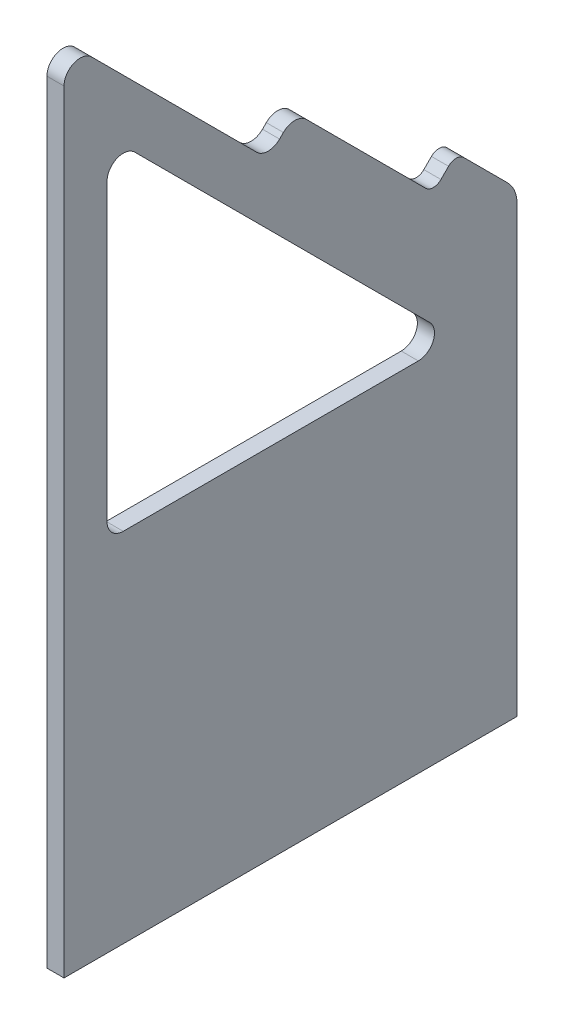
ISO-10303-21;
HEADER;
FILE_DESCRIPTION(('STEP AP214'),'2;1');
FILE_NAME('part.step','',(''),(''),'','','');
FILE_SCHEMA(('AUTOMOTIVE_DESIGN { 1 0 10303 214 1 1 1 1 }'));
ENDSEC;
DATA;
#1=APPLICATION_CONTEXT('core data for automotive mechanical design processes');
#2=APPLICATION_PROTOCOL_DEFINITION('international standard','automotive_design',2000,#1);
#3=PRODUCT_CONTEXT('',#1,'mechanical');
#4=PRODUCT('Part','Part','',(#3));
#5=PRODUCT_RELATED_PRODUCT_CATEGORY('part','',(#4));
#6=PRODUCT_DEFINITION_FORMATION('','',#4);
#7=PRODUCT_DEFINITION_CONTEXT('part definition',#1,'design');
#8=PRODUCT_DEFINITION('design','',#6,#7);
#9=PRODUCT_DEFINITION_SHAPE('','',#8);
#10=(LENGTH_UNIT() NAMED_UNIT(*) SI_UNIT(.MILLI.,.METRE.));
#11=(NAMED_UNIT(*) PLANE_ANGLE_UNIT() SI_UNIT($,.RADIAN.));
#12=(NAMED_UNIT(*) SI_UNIT($,.STERADIAN.) SOLID_ANGLE_UNIT());
#13=UNCERTAINTY_MEASURE_WITH_UNIT(LENGTH_MEASURE(1.E-05),#10,'distance_accuracy_value','');
#14=(GEOMETRIC_REPRESENTATION_CONTEXT(3) GLOBAL_UNCERTAINTY_ASSIGNED_CONTEXT((#13)) GLOBAL_UNIT_ASSIGNED_CONTEXT((#10,
#11,#12)) REPRESENTATION_CONTEXT('',''));
#15=CARTESIAN_POINT('',(0.,0.,0.));
#16=DIRECTION('',(0.,0.,1.));
#17=DIRECTION('',(1.,0.,0.));
#18=AXIS2_PLACEMENT_3D('',#15,#16,#17);
#19=CARTESIAN_POINT('',(3.175,150.710678118654,42.0728534805994));
#20=DIRECTION('',(0.,0.,-1.));
#21=DIRECTION('',(0.,1.,0.));
#22=AXIS2_PLACEMENT_3D('',#19,#20,#21);
#23=PLANE('',#22);
#24=DIRECTION('',(0.,-1.,0.));
#25=VECTOR('',#24,1.);
#26=CARTESIAN_POINT('',(3.175,150.710678118654,42.0728534805994));
#27=LINE('',#26,#25);
#28=CARTESIAN_POINT('',(3.175,143.468037431535,42.0728534805994));
#29=VERTEX_POINT('',#28);
#30=CARTESIAN_POINT('',(3.175,0.,42.0728534805994));
#31=VERTEX_POINT('',#30);
#32=EDGE_CURVE('E179',#29,#31,#27,.T.);
#33=ORIENTED_EDGE('',*,*,#32,.F.);
#34=DIRECTION('',(-1.,0.,0.));
#35=VECTOR('',#34,1.);
#36=CARTESIAN_POINT('',(3.175,143.468037431535,42.0728534805994));
#37=LINE('',#36,#35);
#38=CARTESIAN_POINT('',(0.,143.468037431535,42.0728534805994));
#39=VERTEX_POINT('',#38);
#40=EDGE_CURVE('E250',#29,#39,#37,.T.);
#41=ORIENTED_EDGE('',*,*,#40,.T.);
#42=DIRECTION('',(0.,-1.,0.));
#43=VECTOR('',#42,1.);
#44=CARTESIAN_POINT('',(0.,150.710678118654,42.0728534805994));
#45=LINE('',#44,#43);
#46=CARTESIAN_POINT('',(0.,0.,42.0728534805994));
#47=VERTEX_POINT('',#46);
#48=EDGE_CURVE('E207',#39,#47,#45,.T.);
#49=ORIENTED_EDGE('',*,*,#48,.T.);
#50=DIRECTION('',(-1.,0.,0.));
#51=VECTOR('',#50,1.);
#52=CARTESIAN_POINT('',(3.175,0.,42.0728534805994));
#53=LINE('',#52,#51);
#54=EDGE_CURVE('E199',#31,#47,#53,.T.);
#55=ORIENTED_EDGE('',*,*,#54,.F.);
#56=EDGE_LOOP('',(#33,#41,#49,#55));
#57=FACE_BOUND('',#56,.T.);
#58=ADVANCED_FACE('F41',(#57),#23,.F.);
#59=CARTESIAN_POINT('',(3.175,0.,42.0728534805994));
#60=DIRECTION('',(0.,1.,0.));
#61=DIRECTION('',(0.,0.,1.));
#62=AXIS2_PLACEMENT_3D('',#59,#60,#61);
#63=PLANE('',#62);
#64=DIRECTION('',(0.,0.,-1.));
#65=VECTOR('',#64,1.);
#66=CARTESIAN_POINT('',(0.,0.,42.0728534805994));
#67=LINE('',#66,#65);
#68=CARTESIAN_POINT('',(0.,0.,-42.0728534805994));
#69=VERTEX_POINT('',#68);
#70=EDGE_CURVE('E393',#47,#69,#67,.T.);
#71=ORIENTED_EDGE('',*,*,#70,.T.);
#72=DIRECTION('',(-1.,0.,0.));
#73=VECTOR('',#72,1.);
#74=CARTESIAN_POINT('',(3.175,0.,-42.0728534805994));
#75=LINE('',#74,#73);
#76=CARTESIAN_POINT('',(3.175,0.,-42.0728534805994));
#77=VERTEX_POINT('',#76);
#78=EDGE_CURVE('E201',#77,#69,#75,.T.);
#79=ORIENTED_EDGE('',*,*,#78,.F.);
#80=DIRECTION('',(0.,0.,-1.));
#81=VECTOR('',#80,1.);
#82=CARTESIAN_POINT('',(3.175,0.,42.0728534805994));
#83=LINE('',#82,#81);
#84=EDGE_CURVE('E185',#31,#77,#83,.T.);
#85=ORIENTED_EDGE('',*,*,#84,.F.);
#86=ORIENTED_EDGE('',*,*,#54,.T.);
#87=EDGE_LOOP('',(#71,#79,#85,#86));
#88=FACE_BOUND('',#87,.T.);
#89=ADVANCED_FACE('F198',(#88),#63,.F.);
#90=CARTESIAN_POINT('',(3.175,0.,-42.0728534805994));
#91=DIRECTION('',(0.,0.,1.));
#92=DIRECTION('',(0.,-1.,0.));
#93=AXIS2_PLACEMENT_3D('',#90,#91,#92);
#94=PLANE('',#93);
#95=DIRECTION('',(0.,1.,0.));
#96=VECTOR('',#95,1.);
#97=CARTESIAN_POINT('',(0.,0.,-42.0728534805994));
#98=LINE('',#97,#96);
#99=CARTESIAN_POINT('',(0.,82.4644660940667,-42.0728534805994));
#100=VERTEX_POINT('',#99);
#101=EDGE_CURVE('E396',#69,#100,#98,.T.);
#102=ORIENTED_EDGE('',*,*,#101,.T.);
#103=DIRECTION('',(-1.,0.,0.));
#104=VECTOR('',#103,1.);
#105=CARTESIAN_POINT('',(3.175,82.4644660940667,-42.0728534805994));
#106=LINE('',#105,#104);
#107=CARTESIAN_POINT('',(3.175,82.4644660940667,-42.0728534805994));
#108=VERTEX_POINT('',#107);
#109=EDGE_CURVE('E223',#100,#108,#106,.F.);
#110=ORIENTED_EDGE('',*,*,#109,.T.);
#111=DIRECTION('',(0.,1.,0.));
#112=VECTOR('',#111,1.);
#113=CARTESIAN_POINT('',(3.175,0.,-42.0728534805994));
#114=LINE('',#113,#112);
#115=EDGE_CURVE('E204',#77,#108,#114,.T.);
#116=ORIENTED_EDGE('',*,*,#115,.F.);
#117=ORIENTED_EDGE('',*,*,#78,.T.);
#118=EDGE_LOOP('',(#102,#110,#116,#117));
#119=FACE_BOUND('',#118,.T.);
#120=ADVANCED_FACE('F428',(#119),#94,.F.);
#121=CARTESIAN_POINT('',(3.175,84.9497474683053,-42.0728534805994));
#122=DIRECTION('',(0.,-0.707106781186558,0.707106781186537));
#123=DIRECTION('',(0.,-0.707106781186537,-0.707106781186558));
#124=AXIS2_PLACEMENT_3D('',#121,#122,#123);
#125=PLANE('',#124);
#126=DIRECTION('',(0.,0.707106781186537,0.707106781186558));
#127=VECTOR('',#126,1.);
#128=CARTESIAN_POINT('',(0.,84.9497474683053,-42.0728534805994));
#129=LINE('',#128,#127);
#130=CARTESIAN_POINT('',(0.,86.707106781186,-40.3154941677186));
#131=VERTEX_POINT('',#130);
#132=CARTESIAN_POINT('',(0.,94.8492424049166,-32.1733585439878));
#133=VERTEX_POINT('',#132);
#134=EDGE_CURVE('E400',#131,#133,#129,.T.);
#135=ORIENTED_EDGE('',*,*,#134,.T.);
#136=DIRECTION('',(1.,0.,0.));
#137=VECTOR('',#136,1.);
#138=CARTESIAN_POINT('',(3.175,94.8492424049166,-32.1733585439878));
#139=LINE('',#138,#137);
#140=CARTESIAN_POINT('',(3.175,94.8492424049166,-32.1733585439878));
#141=VERTEX_POINT('',#140);
#142=EDGE_CURVE('E292',#133,#141,#139,.T.);
#143=ORIENTED_EDGE('',*,*,#142,.T.);
#144=DIRECTION('',(0.,0.707106781186537,0.707106781186558));
#145=VECTOR('',#144,1.);
#146=CARTESIAN_POINT('',(3.175,84.9497474683053,-42.0728534805994));
#147=LINE('',#146,#145);
#148=CARTESIAN_POINT('',(3.175,86.707106781186,-40.3154941677186));
#149=VERTEX_POINT('',#148);
#150=EDGE_CURVE('E384',#149,#141,#147,.T.);
#151=ORIENTED_EDGE('',*,*,#150,.F.);
#152=DIRECTION('',(-1.,0.,0.));
#153=VECTOR('',#152,1.);
#154=CARTESIAN_POINT('',(3.175,86.707106781186,-40.3154941677186));
#155=LINE('',#154,#153);
#156=EDGE_CURVE('E210',#149,#131,#155,.T.);
#157=ORIENTED_EDGE('',*,*,#156,.T.);
#158=EDGE_LOOP('',(#135,#143,#151,#157));
#159=FACE_BOUND('',#158,.T.);
#160=ADVANCED_FACE('F479',(#159),#125,.F.);
#161=CARTESIAN_POINT('',(3.175,96.2634559672896,-30.7591449816147));
#162=DIRECTION('',(0.,-0.70710678118655,-0.707106781186545));
#163=DIRECTION('',(0.,0.707106781186545,-0.70710678118655));
#164=AXIS2_PLACEMENT_3D('',#161,#162,#163);
#165=PLANE('',#164);
#166=DIRECTION('',(0.,-0.707106781186545,0.70710678118655));
#167=VECTOR('',#166,1.);
#168=CARTESIAN_POINT('',(0.,96.2634559672896,-30.7591449816147));
#169=LINE('',#168,#167);
#170=CARTESIAN_POINT('',(0.,94.8492424049166,-29.3449314192416));
#171=VERTEX_POINT('',#170);
#172=CARTESIAN_POINT('',(0.,93.4350288425434,-27.9307178568685));
#173=VERTEX_POINT('',#172);
#174=EDGE_CURVE('E404',#171,#173,#169,.T.);
#175=ORIENTED_EDGE('',*,*,#174,.T.);
#176=DIRECTION('',(1.,0.,0.));
#177=VECTOR('',#176,1.);
#178=CARTESIAN_POINT('',(3.175,93.4350288425434,-27.9307178568685));
#179=LINE('',#178,#177);
#180=CARTESIAN_POINT('',(3.175,93.4350288425434,-27.9307178568685));
#181=VERTEX_POINT('',#180);
#182=EDGE_CURVE('E284',#173,#181,#179,.T.);
#183=ORIENTED_EDGE('',*,*,#182,.T.);
#184=DIRECTION('',(0.,-0.707106781186545,0.70710678118655));
#185=VECTOR('',#184,1.);
#186=CARTESIAN_POINT('',(3.175,96.2634559672896,-30.7591449816147));
#187=LINE('',#186,#185);
#188=CARTESIAN_POINT('',(3.175,94.8492424049166,-29.3449314192416));
#189=VERTEX_POINT('',#188);
#190=EDGE_CURVE('E337',#189,#181,#187,.T.);
#191=ORIENTED_EDGE('',*,*,#190,.F.);
#192=DIRECTION('',(1.,0.,0.));
#193=VECTOR('',#192,1.);
#194=CARTESIAN_POINT('',(3.175,94.8492424049166,-29.3449314192416));
#195=LINE('',#194,#193);
#196=EDGE_CURVE('E281',#189,#171,#195,.F.);
#197=ORIENTED_EDGE('',*,*,#196,.T.);
#198=EDGE_LOOP('',(#175,#183,#191,#197));
#199=FACE_BOUND('',#198,.T.);
#200=ADVANCED_FACE('F472',(#199),#165,.F.);
#201=CARTESIAN_POINT('',(3.175,79.9999999999991,-28.637824638055));
#202=DIRECTION('',(0.,-0.707106781186544,0.707106781186551));
#203=DIRECTION('',(0.,-0.707106781186551,-0.707106781186544));
#204=AXIS2_PLACEMENT_3D('',#201,#202,#203);
#205=PLANE('',#204);
#206=DIRECTION('',(0.,0.707106781186551,0.707106781186544));
#207=VECTOR('',#206,1.);
#208=CARTESIAN_POINT('',(3.175,79.9999999999991,-28.637824638055));
#209=LINE('',#208,#207);
#210=CARTESIAN_POINT('',(3.175,114.915999231106,6.27817459305203));
#211=VERTEX_POINT('',#210);
#212=CARTESIAN_POINT('',(3.175,145.589357775094,36.9515331370397));
#213=VERTEX_POINT('',#212);
#214=EDGE_CURVE('E217',#211,#213,#209,.T.);
#215=ORIENTED_EDGE('',*,*,#214,.F.);
#216=DIRECTION('',(1.,0.,0.));
#217=VECTOR('',#216,1.);
#218=CARTESIAN_POINT('',(3.175,114.915999231106,6.27817459305203));
#219=LINE('',#218,#217);
#220=CARTESIAN_POINT('',(0.,114.915999231106,6.27817459305203));
#221=VERTEX_POINT('',#220);
#222=EDGE_CURVE('E315',#211,#221,#219,.F.);
#223=ORIENTED_EDGE('',*,*,#222,.T.);
#224=DIRECTION('',(0.,0.707106781186551,0.707106781186544));
#225=VECTOR('',#224,1.);
#226=CARTESIAN_POINT('',(0.,79.9999999999991,-28.637824638055));
#227=LINE('',#226,#225);
#228=CARTESIAN_POINT('',(0.,145.589357775094,36.9515331370397));
#229=VERTEX_POINT('',#228);
#230=EDGE_CURVE('E194',#221,#229,#227,.T.);
#231=ORIENTED_EDGE('',*,*,#230,.T.);
#232=DIRECTION('',(-1.,0.,0.));
#233=VECTOR('',#232,1.);
#234=CARTESIAN_POINT('',(3.175,145.589357775094,36.9515331370397));
#235=LINE('',#234,#233);
#236=EDGE_CURVE('E257',#229,#213,#235,.F.);
#237=ORIENTED_EDGE('',*,*,#236,.T.);
#238=EDGE_LOOP('',(#215,#223,#231,#237));
#239=FACE_BOUND('',#238,.T.);
#240=ADVANCED_FACE('F333',(#239),#205,.F.);
#241=CARTESIAN_POINT('',(3.175,0.,0.));
#242=DIRECTION('',(1.,0.,0.));
#243=DIRECTION('',(0.,0.,-1.));
#244=AXIS2_PLACEMENT_3D('',#241,#242,#243);
#245=PLANE('',#244);
#246=DIRECTION('',(0.,0.707106781186547,0.707106781186548));
#247=VECTOR('',#246,1.);
#248=CARTESIAN_POINT('',(3.175,92.0208152801703,-26.5165042944954));
#249=LINE('',#248,#247);
#250=CARTESIAN_POINT('',(3.175,93.4350288425434,-25.1022907321223));
#251=VERTEX_POINT('',#250);
#252=CARTESIAN_POINT('',(3.175,115.623106012293,-2.91421356237295));
#253=VERTEX_POINT('',#252);
#254=EDGE_CURVE('E358',#251,#253,#249,.T.);
#255=ORIENTED_EDGE('',*,*,#254,.T.);
#256=CARTESIAN_POINT('',(3.175,113.501785668733,-0.792893218813307));
#257=DIRECTION('',(1.,0.,0.));
#258=DIRECTION('',(0.,0.,-1.));
#259=AXIS2_PLACEMENT_3D('',#256,#257,#258);
#260=CIRCLE('',#259,3.);
#261=CARTESIAN_POINT('',(3.175,115.623106012293,1.32842712474633));
#262=VERTEX_POINT('',#261);
#263=EDGE_CURVE('E65',#253,#262,#260,.T.);
#264=ORIENTED_EDGE('',*,*,#263,.T.);
#265=DIRECTION('',(0.,-0.707106781186547,0.707106781186548));
#266=VECTOR('',#265,1.);
#267=CARTESIAN_POINT('',(3.175,117.744426355852,-0.792893218813311));
#268=LINE('',#267,#266);
#269=CARTESIAN_POINT('',(3.175,114.915999231106,2.03553390593272));
#270=VERTEX_POINT('',#269);
#271=EDGE_CURVE('E328',#262,#270,#268,.T.);
#272=ORIENTED_EDGE('',*,*,#271,.T.);
#273=CARTESIAN_POINT('',(3.175,117.037319574666,4.15685424949237));
#274=DIRECTION('',(1.,0.,0.));
#275=DIRECTION('',(0.,0.,-1.));
#276=AXIS2_PLACEMENT_3D('',#273,#274,#275);
#277=CIRCLE('',#276,3.);
#278=EDGE_CURVE('E50',#270,#211,#277,.F.);
#279=ORIENTED_EDGE('',*,*,#278,.T.);
#280=ORIENTED_EDGE('',*,*,#214,.T.);
#281=CARTESIAN_POINT('',(3.175,143.468037431535,39.0728534805994));
#282=DIRECTION('',(1.,0.,0.));
#283=DIRECTION('',(0.,0.,-1.));
#284=AXIS2_PLACEMENT_3D('',#281,#282,#283);
#285=CIRCLE('',#284,3.);
#286=EDGE_CURVE('E188',#213,#29,#285,.T.);
#287=ORIENTED_EDGE('',*,*,#286,.T.);
#288=ORIENTED_EDGE('',*,*,#32,.T.);
#289=ORIENTED_EDGE('',*,*,#84,.T.);
#290=ORIENTED_EDGE('',*,*,#115,.T.);
#291=CARTESIAN_POINT('',(3.175,82.4644660940667,-36.0728534805994));
#292=DIRECTION('',(1.,0.,0.));
#293=DIRECTION('',(0.,0.,-1.));
#294=AXIS2_PLACEMENT_3D('',#291,#292,#293);
#295=CIRCLE('',#294,6.);
#296=EDGE_CURVE('E226',#108,#149,#295,.T.);
#297=ORIENTED_EDGE('',*,*,#296,.T.);
#298=ORIENTED_EDGE('',*,*,#150,.T.);
#299=CARTESIAN_POINT('',(3.175,93.4350288425435,-30.7591449816147));
#300=DIRECTION('',(1.,0.,0.));
#301=DIRECTION('',(0.,0.,-1.));
#302=AXIS2_PLACEMENT_3D('',#299,#300,#301);
#303=CIRCLE('',#302,2.);
#304=EDGE_CURVE('E296',#141,#189,#303,.T.);
#305=ORIENTED_EDGE('',*,*,#304,.T.);
#306=ORIENTED_EDGE('',*,*,#190,.T.);
#307=CARTESIAN_POINT('',(3.175,94.8492424049165,-26.5165042944954));
#308=DIRECTION('',(1.,0.,0.));
#309=DIRECTION('',(0.,0.,-1.));
#310=AXIS2_PLACEMENT_3D('',#307,#308,#309);
#311=CIRCLE('',#310,2.);
#312=EDGE_CURVE('E302',#181,#251,#311,.F.);
#313=ORIENTED_EDGE('',*,*,#312,.T.);
#314=EDGE_LOOP('',(#255,#264,#272,#279,#280,#287,#288,#289,#290,#297,#298,#305,#306,#313));
#315=FACE_BOUND('',#314,.T.);
#316=DIRECTION('',(0.,0.707106781186547,0.707106781186548));
#317=VECTOR('',#316,1.);
#318=CARTESIAN_POINT('',(3.175,131.396969619669,34.0728534805994));
#319=LINE('',#318,#317);
#320=CARTESIAN_POINT('',(3.175,71.4713203432283,-25.852795795841));
#321=VERTEX_POINT('',#320);
#322=CARTESIAN_POINT('',(3.175,126.275649276109,28.9515331370397));
#323=VERTEX_POINT('',#322);
#324=EDGE_CURVE('E348',#321,#323,#319,.T.);
#325=ORIENTED_EDGE('',*,*,#324,.F.);
#326=CARTESIAN_POINT('',(3.175,69.3499999996687,-23.7314754522813));
#327=DIRECTION('',(1.,0.,0.));
#328=DIRECTION('',(0.,0.,-1.));
#329=AXIS2_PLACEMENT_3D('',#326,#327,#328);
#330=CIRCLE('',#329,3.);
#331=CARTESIAN_POINT('',(3.175,66.3499999996687,-23.7314754522813));
#332=VERTEX_POINT('',#331);
#333=EDGE_CURVE('E263',#321,#332,#330,.F.);
#334=ORIENTED_EDGE('',*,*,#333,.T.);
#335=DIRECTION('',(0.,0.,-1.));
#336=VECTOR('',#335,1.);
#337=CARTESIAN_POINT('',(3.175,66.3499999996687,-30.9741161394006));
#338=LINE('',#337,#336);
#339=CARTESIAN_POINT('',(3.175,66.3499999996687,31.0728534805994));
#340=VERTEX_POINT('',#339);
#341=EDGE_CURVE('E368',#340,#332,#338,.T.);
#342=ORIENTED_EDGE('',*,*,#341,.F.);
#343=CARTESIAN_POINT('',(3.175,69.3499999996687,31.0728534805994));
#344=DIRECTION('',(1.,0.,0.));
#345=DIRECTION('',(0.,0.,-1.));
#346=AXIS2_PLACEMENT_3D('',#343,#344,#345);
#347=CIRCLE('',#346,3.);
#348=CARTESIAN_POINT('',(3.175,69.3499999996687,34.0728534805994));
#349=VERTEX_POINT('',#348);
#350=EDGE_CURVE('E269',#340,#349,#347,.F.);
#351=ORIENTED_EDGE('',*,*,#350,.T.);
#352=DIRECTION('',(0.,-1.,0.));
#353=VECTOR('',#352,1.);
#354=CARTESIAN_POINT('',(3.175,66.3499999996687,34.0728534805994));
#355=LINE('',#354,#353);
#356=CARTESIAN_POINT('',(3.175,124.154328932549,34.0728534805994));
#357=VERTEX_POINT('',#356);
#358=EDGE_CURVE('E354',#357,#349,#355,.T.);
#359=ORIENTED_EDGE('',*,*,#358,.F.);
#360=CARTESIAN_POINT('',(3.175,124.154328932549,31.0728534805994));
#361=DIRECTION('',(1.,0.,0.));
#362=DIRECTION('',(0.,0.,-1.));
#363=AXIS2_PLACEMENT_3D('',#360,#361,#362);
#364=CIRCLE('',#363,3.);
#365=EDGE_CURVE('E275',#357,#323,#364,.F.);
#366=ORIENTED_EDGE('',*,*,#365,.T.);
#367=EDGE_LOOP('',(#325,#334,#342,#351,#359,#366));
#368=FACE_BOUND('',#367,.T.);
#369=ADVANCED_FACE('F182',(#315,#368),#245,.T.);
#370=CARTESIAN_POINT('',(0.,0.,0.));
#371=DIRECTION('',(1.,0.,0.));
#372=DIRECTION('',(0.,0.,-1.));
#373=AXIS2_PLACEMENT_3D('',#370,#371,#372);
#374=PLANE('',#373);
#375=DIRECTION('',(0.,0.707106781186547,-0.707106781186548));
#376=VECTOR('',#375,1.);
#377=CARTESIAN_POINT('',(0.,117.744426355852,-0.792893218813311));
#378=LINE('',#377,#376);
#379=CARTESIAN_POINT('',(0.,114.915999231106,2.03553390593272));
#380=VERTEX_POINT('',#379);
#381=CARTESIAN_POINT('',(0.,115.623106012293,1.32842712474633));
#382=VERTEX_POINT('',#381);
#383=EDGE_CURVE('E344',#380,#382,#378,.T.);
#384=ORIENTED_EDGE('',*,*,#383,.T.);
#385=CARTESIAN_POINT('',(0.,113.501785668733,-0.792893218813307));
#386=DIRECTION('',(1.,0.,0.));
#387=DIRECTION('',(0.,0.,-1.));
#388=AXIS2_PLACEMENT_3D('',#385,#386,#387);
#389=CIRCLE('',#388,3.);
#390=CARTESIAN_POINT('',(0.,115.623106012293,-2.91421356237295));
#391=VERTEX_POINT('',#390);
#392=EDGE_CURVE('E57',#382,#391,#389,.F.);
#393=ORIENTED_EDGE('',*,*,#392,.T.);
#394=DIRECTION('',(0.,-0.707106781186547,-0.707106781186548));
#395=VECTOR('',#394,1.);
#396=CARTESIAN_POINT('',(0.,92.0208152801703,-26.5165042944954));
#397=LINE('',#396,#395);
#398=CARTESIAN_POINT('',(0.,93.4350288425434,-25.1022907321223));
#399=VERTEX_POINT('',#398);
#400=EDGE_CURVE('E349',#391,#399,#397,.T.);
#401=ORIENTED_EDGE('',*,*,#400,.T.);
#402=CARTESIAN_POINT('',(0.,94.8492424049165,-26.5165042944954));
#403=DIRECTION('',(1.,0.,0.));
#404=DIRECTION('',(0.,0.,-1.));
#405=AXIS2_PLACEMENT_3D('',#402,#403,#404);
#406=CIRCLE('',#405,2.);
#407=EDGE_CURVE('E305',#399,#173,#406,.T.);
#408=ORIENTED_EDGE('',*,*,#407,.T.);
#409=ORIENTED_EDGE('',*,*,#174,.F.);
#410=CARTESIAN_POINT('',(0.,93.4350288425435,-30.7591449816147));
#411=DIRECTION('',(1.,0.,0.));
#412=DIRECTION('',(0.,0.,-1.));
#413=AXIS2_PLACEMENT_3D('',#410,#411,#412);
#414=CIRCLE('',#413,2.);
#415=EDGE_CURVE('E299',#171,#133,#414,.F.);
#416=ORIENTED_EDGE('',*,*,#415,.T.);
#417=ORIENTED_EDGE('',*,*,#134,.F.);
#418=CARTESIAN_POINT('',(0.,82.4644660940667,-36.0728534805994));
#419=DIRECTION('',(1.,0.,0.));
#420=DIRECTION('',(0.,0.,-1.));
#421=AXIS2_PLACEMENT_3D('',#418,#419,#420);
#422=CIRCLE('',#421,6.);
#423=EDGE_CURVE('E215',#131,#100,#422,.F.);
#424=ORIENTED_EDGE('',*,*,#423,.T.);
#425=ORIENTED_EDGE('',*,*,#101,.F.);
#426=ORIENTED_EDGE('',*,*,#70,.F.);
#427=ORIENTED_EDGE('',*,*,#48,.F.);
#428=CARTESIAN_POINT('',(0.,143.468037431535,39.0728534805994));
#429=DIRECTION('',(1.,0.,0.));
#430=DIRECTION('',(0.,0.,-1.));
#431=AXIS2_PLACEMENT_3D('',#428,#429,#430);
#432=CIRCLE('',#431,3.);
#433=EDGE_CURVE('E253',#39,#229,#432,.F.);
#434=ORIENTED_EDGE('',*,*,#433,.T.);
#435=ORIENTED_EDGE('',*,*,#230,.F.);
#436=CARTESIAN_POINT('',(0.,117.037319574666,4.15685424949237));
#437=DIRECTION('',(1.,0.,0.));
#438=DIRECTION('',(0.,0.,-1.));
#439=AXIS2_PLACEMENT_3D('',#436,#437,#438);
#440=CIRCLE('',#439,3.);
#441=EDGE_CURVE('E11',#221,#380,#440,.T.);
#442=ORIENTED_EDGE('',*,*,#441,.T.);
#443=EDGE_LOOP('',(#384,#393,#401,#408,#409,#416,#417,#424,#425,#426,#427,#434,#435,#442));
#444=FACE_BOUND('',#443,.T.);
#445=DIRECTION('',(0.,-1.,0.));
#446=VECTOR('',#445,1.);
#447=CARTESIAN_POINT('',(0.,66.3499999996687,34.0728534805994));
#448=LINE('',#447,#446);
#449=CARTESIAN_POINT('',(0.,124.154328932549,34.0728534805994));
#450=VERTEX_POINT('',#449);
#451=CARTESIAN_POINT('',(0.,69.3499999996687,34.0728534805994));
#452=VERTEX_POINT('',#451);
#453=EDGE_CURVE('E367',#450,#452,#448,.T.);
#454=ORIENTED_EDGE('',*,*,#453,.T.);
#455=CARTESIAN_POINT('',(0.,69.3499999996687,31.0728534805994));
#456=DIRECTION('',(1.,0.,0.));
#457=DIRECTION('',(0.,0.,-1.));
#458=AXIS2_PLACEMENT_3D('',#455,#456,#457);
#459=CIRCLE('',#458,3.);
#460=CARTESIAN_POINT('',(0.,66.3499999996687,31.0728534805994));
#461=VERTEX_POINT('',#460);
#462=EDGE_CURVE('E272',#452,#461,#459,.T.);
#463=ORIENTED_EDGE('',*,*,#462,.T.);
#464=DIRECTION('',(0.,0.,-1.));
#465=VECTOR('',#464,1.);
#466=CARTESIAN_POINT('',(0.,66.3499999996687,-30.9741161394006));
#467=LINE('',#466,#465);
#468=CARTESIAN_POINT('',(0.,66.3499999996687,-23.7314754522813));
#469=VERTEX_POINT('',#468);
#470=EDGE_CURVE('E372',#461,#469,#467,.T.);
#471=ORIENTED_EDGE('',*,*,#470,.T.);
#472=CARTESIAN_POINT('',(0.,69.3499999996687,-23.7314754522813));
#473=DIRECTION('',(1.,0.,0.));
#474=DIRECTION('',(0.,0.,-1.));
#475=AXIS2_PLACEMENT_3D('',#472,#473,#474);
#476=CIRCLE('',#475,3.);
#477=CARTESIAN_POINT('',(0.,71.4713203432283,-25.852795795841));
#478=VERTEX_POINT('',#477);
#479=EDGE_CURVE('E266',#469,#478,#476,.T.);
#480=ORIENTED_EDGE('',*,*,#479,.T.);
#481=DIRECTION('',(0.,0.707106781186547,0.707106781186548));
#482=VECTOR('',#481,1.);
#483=CARTESIAN_POINT('',(0.,131.396969619669,34.0728534805994));
#484=LINE('',#483,#482);
#485=CARTESIAN_POINT('',(0.,126.275649276109,28.9515331370397));
#486=VERTEX_POINT('',#485);
#487=EDGE_CURVE('E363',#478,#486,#484,.T.);
#488=ORIENTED_EDGE('',*,*,#487,.T.);
#489=CARTESIAN_POINT('',(0.,124.154328932549,31.0728534805994));
#490=DIRECTION('',(1.,0.,0.));
#491=DIRECTION('',(0.,0.,-1.));
#492=AXIS2_PLACEMENT_3D('',#489,#490,#491);
#493=CIRCLE('',#492,3.);
#494=EDGE_CURVE('E278',#486,#450,#493,.T.);
#495=ORIENTED_EDGE('',*,*,#494,.T.);
#496=EDGE_LOOP('',(#454,#463,#471,#480,#488,#495));
#497=FACE_BOUND('',#496,.T.);
#498=ADVANCED_FACE('F342',(#444,#497),#374,.F.);
#499=CARTESIAN_POINT('',(3.175,82.4644660940667,-36.0728534805994));
#500=DIRECTION('',(-1.,0.,0.));
#501=DIRECTION('',(0.,0.,1.));
#502=AXIS2_PLACEMENT_3D('',#499,#500,#501);
#503=CYLINDRICAL_SURFACE('',#502,6.);
#504=ORIENTED_EDGE('',*,*,#296,.F.);
#505=ORIENTED_EDGE('',*,*,#109,.F.);
#506=ORIENTED_EDGE('',*,*,#423,.F.);
#507=ORIENTED_EDGE('',*,*,#156,.F.);
#508=EDGE_LOOP('',(#504,#505,#506,#507));
#509=FACE_BOUND('',#508,.T.);
#510=ADVANCED_FACE('F432',(#509),#503,.T.);
#511=CARTESIAN_POINT('',(0.,131.396969619669,34.0728534805994));
#512=DIRECTION('',(0.,0.707106781186548,-0.707106781186547));
#513=DIRECTION('',(0.,0.707106781186547,0.707106781186548));
#514=AXIS2_PLACEMENT_3D('',#511,#512,#513);
#515=PLANE('',#514);
#516=ORIENTED_EDGE('',*,*,#487,.F.);
#517=DIRECTION('',(1.,0.,0.));
#518=VECTOR('',#517,1.);
#519=CARTESIAN_POINT('',(3.175,71.4713203432283,-25.852795795841));
#520=LINE('',#519,#518);
#521=EDGE_CURVE('E232',#478,#321,#520,.T.);
#522=ORIENTED_EDGE('',*,*,#521,.T.);
#523=ORIENTED_EDGE('',*,*,#324,.T.);
#524=DIRECTION('',(1.,0.,0.));
#525=VECTOR('',#524,1.);
#526=CARTESIAN_POINT('',(0.,126.275649276109,28.9515331370397));
#527=LINE('',#526,#525);
#528=EDGE_CURVE('E229',#323,#486,#527,.F.);
#529=ORIENTED_EDGE('',*,*,#528,.T.);
#530=EDGE_LOOP('',(#516,#522,#523,#529));
#531=FACE_BOUND('',#530,.T.);
#532=ADVANCED_FACE('F435',(#531),#515,.F.);
#533=CARTESIAN_POINT('',(0.,66.3499999996687,-30.9741161394006));
#534=DIRECTION('',(0.,-1.,0.));
#535=DIRECTION('',(0.,0.,-1.));
#536=AXIS2_PLACEMENT_3D('',#533,#534,#535);
#537=PLANE('',#536);
#538=ORIENTED_EDGE('',*,*,#341,.T.);
#539=DIRECTION('',(1.,0.,0.));
#540=VECTOR('',#539,1.);
#541=CARTESIAN_POINT('',(0.,66.3499999996687,-23.7314754522813));
#542=LINE('',#541,#540);
#543=EDGE_CURVE('E240',#332,#469,#542,.F.);
#544=ORIENTED_EDGE('',*,*,#543,.T.);
#545=ORIENTED_EDGE('',*,*,#470,.F.);
#546=DIRECTION('',(1.,0.,0.));
#547=VECTOR('',#546,1.);
#548=CARTESIAN_POINT('',(3.175,66.3499999996687,31.0728534805994));
#549=LINE('',#548,#547);
#550=EDGE_CURVE('E236',#461,#340,#549,.T.);
#551=ORIENTED_EDGE('',*,*,#550,.T.);
#552=EDGE_LOOP('',(#538,#544,#545,#551));
#553=FACE_BOUND('',#552,.T.);
#554=ADVANCED_FACE('F453',(#553),#537,.F.);
#555=CARTESIAN_POINT('',(0.,66.3499999996687,34.0728534805994));
#556=DIRECTION('',(0.,0.,1.));
#557=DIRECTION('',(1.,0.,0.));
#558=AXIS2_PLACEMENT_3D('',#555,#556,#557);
#559=PLANE('',#558);
#560=ORIENTED_EDGE('',*,*,#358,.T.);
#561=DIRECTION('',(1.,0.,0.));
#562=VECTOR('',#561,1.);
#563=CARTESIAN_POINT('',(0.,69.3499999996687,34.0728534805994));
#564=LINE('',#563,#562);
#565=EDGE_CURVE('E247',#349,#452,#564,.F.);
#566=ORIENTED_EDGE('',*,*,#565,.T.);
#567=ORIENTED_EDGE('',*,*,#453,.F.);
#568=DIRECTION('',(1.,0.,0.));
#569=VECTOR('',#568,1.);
#570=CARTESIAN_POINT('',(3.175,124.154328932549,34.0728534805994));
#571=LINE('',#570,#569);
#572=EDGE_CURVE('E243',#450,#357,#571,.T.);
#573=ORIENTED_EDGE('',*,*,#572,.T.);
#574=EDGE_LOOP('',(#560,#566,#567,#573));
#575=FACE_BOUND('',#574,.T.);
#576=ADVANCED_FACE('F440',(#575),#559,.F.);
#577=CARTESIAN_POINT('',(0.,69.3499999996687,-23.7314754522813));
#578=DIRECTION('',(-1.,0.,0.));
#579=DIRECTION('',(0.,0.,1.));
#580=AXIS2_PLACEMENT_3D('',#577,#578,#579);
#581=CYLINDRICAL_SURFACE('',#580,3.);
#582=ORIENTED_EDGE('',*,*,#479,.F.);
#583=ORIENTED_EDGE('',*,*,#543,.F.);
#584=ORIENTED_EDGE('',*,*,#333,.F.);
#585=ORIENTED_EDGE('',*,*,#521,.F.);
#586=EDGE_LOOP('',(#582,#583,#584,#585));
#587=FACE_BOUND('',#586,.T.);
#588=ADVANCED_FACE('F437',(#587),#581,.F.);
#589=CARTESIAN_POINT('',(0.,69.3499999996687,31.0728534805994));
#590=DIRECTION('',(-1.,0.,0.));
#591=DIRECTION('',(0.,0.,1.));
#592=AXIS2_PLACEMENT_3D('',#589,#590,#591);
#593=CYLINDRICAL_SURFACE('',#592,3.);
#594=ORIENTED_EDGE('',*,*,#462,.F.);
#595=ORIENTED_EDGE('',*,*,#565,.F.);
#596=ORIENTED_EDGE('',*,*,#350,.F.);
#597=ORIENTED_EDGE('',*,*,#550,.F.);
#598=EDGE_LOOP('',(#594,#595,#596,#597));
#599=FACE_BOUND('',#598,.T.);
#600=ADVANCED_FACE('F419',(#599),#593,.F.);
#601=CARTESIAN_POINT('',(0.,124.154328932549,31.0728534805994));
#602=DIRECTION('',(-1.,0.,0.));
#603=DIRECTION('',(0.,0.,1.));
#604=AXIS2_PLACEMENT_3D('',#601,#602,#603);
#605=CYLINDRICAL_SURFACE('',#604,3.);
#606=ORIENTED_EDGE('',*,*,#494,.F.);
#607=ORIENTED_EDGE('',*,*,#528,.F.);
#608=ORIENTED_EDGE('',*,*,#365,.F.);
#609=ORIENTED_EDGE('',*,*,#572,.F.);
#610=EDGE_LOOP('',(#606,#607,#608,#609));
#611=FACE_BOUND('',#610,.T.);
#612=ADVANCED_FACE('F411',(#611),#605,.F.);
#613=CARTESIAN_POINT('',(3.175,143.468037431535,39.0728534805994));
#614=DIRECTION('',(-1.,0.,0.));
#615=DIRECTION('',(0.,0.,1.));
#616=AXIS2_PLACEMENT_3D('',#613,#614,#615);
#617=CYLINDRICAL_SURFACE('',#616,3.);
#618=ORIENTED_EDGE('',*,*,#286,.F.);
#619=ORIENTED_EDGE('',*,*,#236,.F.);
#620=ORIENTED_EDGE('',*,*,#433,.F.);
#621=ORIENTED_EDGE('',*,*,#40,.F.);
#622=EDGE_LOOP('',(#618,#619,#620,#621));
#623=FACE_BOUND('',#622,.T.);
#624=ADVANCED_FACE('F409',(#623),#617,.T.);
#625=CARTESIAN_POINT('',(-56.4584406426843,117.744426355852,-0.792893218813311));
#626=DIRECTION('',(0.,0.707106781186548,0.707106781186547));
#627=DIRECTION('',(0.,-0.707106781186547,0.707106781186548));
#628=AXIS2_PLACEMENT_3D('',#625,#626,#627);
#629=PLANE('',#628);
#630=ORIENTED_EDGE('',*,*,#383,.F.);
#631=DIRECTION('',(1.,0.,0.));
#632=VECTOR('',#631,1.);
#633=CARTESIAN_POINT('',(-56.4584406426843,114.915999231106,2.03553390593272));
#634=LINE('',#633,#632);
#635=EDGE_CURVE('E311',#380,#270,#634,.T.);
#636=ORIENTED_EDGE('',*,*,#635,.T.);
#637=ORIENTED_EDGE('',*,*,#271,.F.);
#638=DIRECTION('',(1.,0.,0.));
#639=VECTOR('',#638,1.);
#640=CARTESIAN_POINT('',(-56.4584406426843,115.623106012293,1.32842712474633));
#641=LINE('',#640,#639);
#642=EDGE_CURVE('E308',#262,#382,#641,.F.);
#643=ORIENTED_EDGE('',*,*,#642,.T.);
#644=EDGE_LOOP('',(#630,#636,#637,#643));
#645=FACE_BOUND('',#644,.T.);
#646=ADVANCED_FACE('F346',(#645),#629,.T.);
#647=CARTESIAN_POINT('',(-56.4584406426843,92.0208152801703,-26.5165042944954));
#648=DIRECTION('',(0.,0.707106781186548,-0.707106781186547));
#649=DIRECTION('',(0.,0.707106781186547,0.707106781186548));
#650=AXIS2_PLACEMENT_3D('',#647,#648,#649);
#651=PLANE('',#650);
#652=ORIENTED_EDGE('',*,*,#400,.F.);
#653=DIRECTION('',(1.,0.,0.));
#654=VECTOR('',#653,1.);
#655=CARTESIAN_POINT('',(-56.4584406426843,115.623106012293,-2.91421356237295));
#656=LINE('',#655,#654);
#657=EDGE_CURVE('E318',#391,#253,#656,.T.);
#658=ORIENTED_EDGE('',*,*,#657,.T.);
#659=ORIENTED_EDGE('',*,*,#254,.F.);
#660=DIRECTION('',(1.,0.,0.));
#661=VECTOR('',#660,1.);
#662=CARTESIAN_POINT('',(-56.4584406426843,93.4350288425434,-25.1022907321223));
#663=LINE('',#662,#661);
#664=EDGE_CURVE('E288',#251,#399,#663,.F.);
#665=ORIENTED_EDGE('',*,*,#664,.T.);
#666=EDGE_LOOP('',(#652,#658,#659,#665));
#667=FACE_BOUND('',#666,.T.);
#668=ADVANCED_FACE('F417',(#667),#651,.T.);
#669=CARTESIAN_POINT('',(3.175,94.8492424049165,-26.5165042944954));
#670=DIRECTION('',(1.,0.,0.));
#671=DIRECTION('',(0.,0.,-1.));
#672=AXIS2_PLACEMENT_3D('',#669,#670,#671);
#673=CYLINDRICAL_SURFACE('',#672,2.);
#674=ORIENTED_EDGE('',*,*,#407,.F.);
#675=ORIENTED_EDGE('',*,*,#664,.F.);
#676=ORIENTED_EDGE('',*,*,#312,.F.);
#677=ORIENTED_EDGE('',*,*,#182,.F.);
#678=EDGE_LOOP('',(#674,#675,#676,#677));
#679=FACE_BOUND('',#678,.T.);
#680=ADVANCED_FACE('F503',(#679),#673,.F.);
#681=CARTESIAN_POINT('',(3.175,93.4350288425435,-30.7591449816147));
#682=DIRECTION('',(1.,0.,0.));
#683=DIRECTION('',(0.,0.,-1.));
#684=AXIS2_PLACEMENT_3D('',#681,#682,#683);
#685=CYLINDRICAL_SURFACE('',#684,2.);
#686=ORIENTED_EDGE('',*,*,#415,.F.);
#687=ORIENTED_EDGE('',*,*,#196,.F.);
#688=ORIENTED_EDGE('',*,*,#304,.F.);
#689=ORIENTED_EDGE('',*,*,#142,.F.);
#690=EDGE_LOOP('',(#686,#687,#688,#689));
#691=FACE_BOUND('',#690,.T.);
#692=ADVANCED_FACE('F496',(#691),#685,.T.);
#693=CARTESIAN_POINT('',(-56.4584406426843,117.037319574666,4.15685424949237));
#694=DIRECTION('',(1.,0.,0.));
#695=DIRECTION('',(0.,0.,-1.));
#696=AXIS2_PLACEMENT_3D('',#693,#694,#695);
#697=CYLINDRICAL_SURFACE('',#696,3.);
#698=ORIENTED_EDGE('',*,*,#441,.F.);
#699=ORIENTED_EDGE('',*,*,#222,.F.);
#700=ORIENTED_EDGE('',*,*,#278,.F.);
#701=ORIENTED_EDGE('',*,*,#635,.F.);
#702=EDGE_LOOP('',(#698,#699,#700,#701));
#703=FACE_BOUND('',#702,.T.);
#704=ADVANCED_FACE('F340',(#703),#697,.F.);
#705=CARTESIAN_POINT('',(-56.4584406426843,113.501785668733,-0.792893218813307));
#706=DIRECTION('',(1.,0.,0.));
#707=DIRECTION('',(0.,0.,-1.));
#708=AXIS2_PLACEMENT_3D('',#705,#706,#707);
#709=CYLINDRICAL_SURFACE('',#708,3.);
#710=ORIENTED_EDGE('',*,*,#392,.F.);
#711=ORIENTED_EDGE('',*,*,#642,.F.);
#712=ORIENTED_EDGE('',*,*,#263,.F.);
#713=ORIENTED_EDGE('',*,*,#657,.F.);
#714=EDGE_LOOP('',(#710,#711,#712,#713));
#715=FACE_BOUND('',#714,.T.);
#716=ADVANCED_FACE('F43',(#715),#709,.T.);
#717=CLOSED_SHELL('',(#58,#89,#120,#160,#200,#240,#369,#498,#510,#532,#554,#576,#588,#600,#612,
#624,#646,#668,#680,#692,#704,#716));
#718=MANIFOLD_SOLID_BREP('B2',#717);
#719=ADVANCED_BREP_SHAPE_REPRESENTATION('',(#18,#718),#14);
#720=SHAPE_DEFINITION_REPRESENTATION(#9,#719);
ENDSEC;
END-ISO-10303-21;
